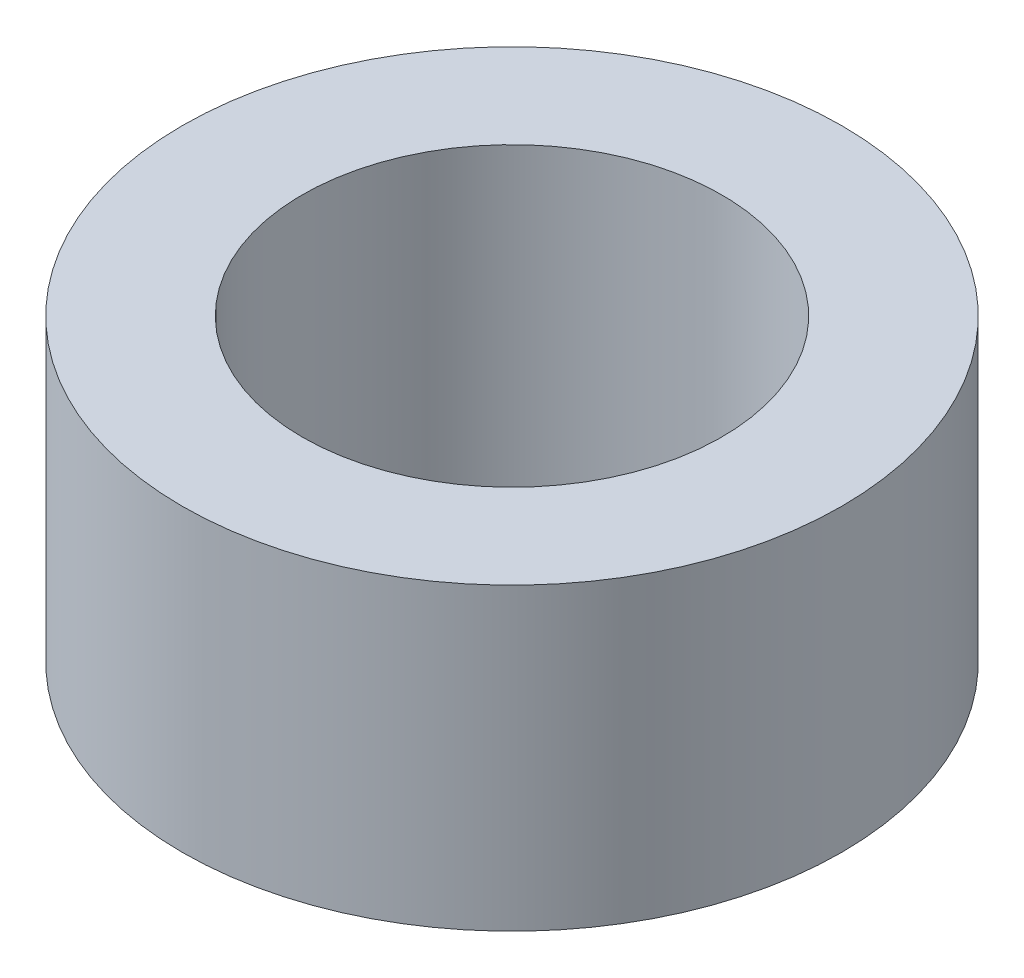
ISO-10303-21;
HEADER;
FILE_DESCRIPTION(('STEP AP214'),'2;1');
FILE_NAME('part.step','',(''),(''),'','','');
FILE_SCHEMA(('AUTOMOTIVE_DESIGN { 1 0 10303 214 1 1 1 1 }'));
ENDSEC;
DATA;
#1=APPLICATION_CONTEXT('core data for automotive mechanical design processes');
#2=APPLICATION_PROTOCOL_DEFINITION('international standard','automotive_design',2000,#1);
#3=PRODUCT_CONTEXT('',#1,'mechanical');
#4=PRODUCT('Part','Part','',(#3));
#5=PRODUCT_RELATED_PRODUCT_CATEGORY('part','',(#4));
#6=PRODUCT_DEFINITION_FORMATION('','',#4);
#7=PRODUCT_DEFINITION_CONTEXT('part definition',#1,'design');
#8=PRODUCT_DEFINITION('design','',#6,#7);
#9=PRODUCT_DEFINITION_SHAPE('','',#8);
#10=(LENGTH_UNIT() NAMED_UNIT(*) SI_UNIT(.MILLI.,.METRE.));
#11=(NAMED_UNIT(*) PLANE_ANGLE_UNIT() SI_UNIT($,.RADIAN.));
#12=(NAMED_UNIT(*) SI_UNIT($,.STERADIAN.) SOLID_ANGLE_UNIT());
#13=UNCERTAINTY_MEASURE_WITH_UNIT(LENGTH_MEASURE(1.E-05),#10,'distance_accuracy_value','');
#14=(GEOMETRIC_REPRESENTATION_CONTEXT(3) GLOBAL_UNCERTAINTY_ASSIGNED_CONTEXT((#13)) GLOBAL_UNIT_ASSIGNED_CONTEXT((#10,
#11,#12)) REPRESENTATION_CONTEXT('',''));
#15=CARTESIAN_POINT('',(0.,0.,0.));
#16=DIRECTION('',(0.,0.,1.));
#17=DIRECTION('',(1.,0.,0.));
#18=AXIS2_PLACEMENT_3D('',#15,#16,#17);
#19=CARTESIAN_POINT('',(0.,10.,0.));
#20=DIRECTION('',(0.,1.,0.));
#21=DIRECTION('',(0.,0.,1.));
#22=AXIS2_PLACEMENT_3D('',#19,#20,#21);
#23=PLANE('',#22);
#24=CARTESIAN_POINT('',(0.,10.,0.));
#25=DIRECTION('',(0.,1.,0.));
#26=DIRECTION('',(0.,0.,1.));
#27=AXIS2_PLACEMENT_3D('',#24,#25,#26);
#28=CIRCLE('',#27,11.);
#29=CARTESIAN_POINT('',(0.,10.,11.));
#30=VERTEX_POINT('',#29);
#31=EDGE_CURVE('E10',#30,#30,#28,.T.);
#32=ORIENTED_EDGE('',*,*,#31,.T.);
#33=EDGE_LOOP('',(#32));
#34=FACE_BOUND('',#33,.T.);
#35=CARTESIAN_POINT('',(0.,10.,0.));
#36=DIRECTION('',(0.,1.,0.));
#37=DIRECTION('',(0.,0.,1.));
#38=AXIS2_PLACEMENT_3D('',#35,#36,#37);
#39=CIRCLE('',#38,7.);
#40=CARTESIAN_POINT('',(0.,10.,7.));
#41=VERTEX_POINT('',#40);
#42=EDGE_CURVE('E29',#41,#41,#39,.T.);
#43=ORIENTED_EDGE('',*,*,#42,.F.);
#44=EDGE_LOOP('',(#43));
#45=FACE_BOUND('',#44,.T.);
#46=ADVANCED_FACE('F14',(#34,#45),#23,.T.);
#47=CARTESIAN_POINT('',(0.,0.,0.));
#48=DIRECTION('',(0.,1.,0.));
#49=DIRECTION('',(0.,0.,1.));
#50=AXIS2_PLACEMENT_3D('',#47,#48,#49);
#51=PLANE('',#50);
#52=CARTESIAN_POINT('',(0.,0.,0.));
#53=DIRECTION('',(0.,1.,0.));
#54=DIRECTION('',(0.,0.,1.));
#55=AXIS2_PLACEMENT_3D('',#52,#53,#54);
#56=CIRCLE('',#55,11.);
#57=CARTESIAN_POINT('',(0.,0.,11.));
#58=VERTEX_POINT('',#57);
#59=EDGE_CURVE('E18',#58,#58,#56,.T.);
#60=ORIENTED_EDGE('',*,*,#59,.F.);
#61=EDGE_LOOP('',(#60));
#62=FACE_BOUND('',#61,.T.);
#63=CARTESIAN_POINT('',(0.,0.,0.));
#64=DIRECTION('',(0.,1.,0.));
#65=DIRECTION('',(0.,0.,1.));
#66=AXIS2_PLACEMENT_3D('',#63,#64,#65);
#67=CIRCLE('',#66,7.);
#68=CARTESIAN_POINT('',(0.,0.,7.));
#69=VERTEX_POINT('',#68);
#70=EDGE_CURVE('E31',#69,#69,#67,.T.);
#71=ORIENTED_EDGE('',*,*,#70,.T.);
#72=EDGE_LOOP('',(#71));
#73=FACE_BOUND('',#72,.T.);
#74=ADVANCED_FACE('F41',(#62,#73),#51,.F.);
#75=CARTESIAN_POINT('',(0.,10.,0.));
#76=DIRECTION('',(0.,-1.,0.));
#77=DIRECTION('',(0.,0.,-1.));
#78=AXIS2_PLACEMENT_3D('',#75,#76,#77);
#79=CYLINDRICAL_SURFACE('',#78,11.);
#80=ORIENTED_EDGE('',*,*,#31,.F.);
#81=EDGE_LOOP('',(#80));
#82=FACE_BOUND('',#81,.T.);
#83=ORIENTED_EDGE('',*,*,#59,.T.);
#84=EDGE_LOOP('',(#83));
#85=FACE_BOUND('',#84,.T.);
#86=ADVANCED_FACE('F16',(#82,#85),#79,.T.);
#87=CARTESIAN_POINT('',(0.,10.,0.));
#88=DIRECTION('',(0.,-1.,0.));
#89=DIRECTION('',(0.,0.,-1.));
#90=AXIS2_PLACEMENT_3D('',#87,#88,#89);
#91=CYLINDRICAL_SURFACE('',#90,7.);
#92=ORIENTED_EDGE('',*,*,#42,.T.);
#93=EDGE_LOOP('',(#92));
#94=FACE_BOUND('',#93,.T.);
#95=ORIENTED_EDGE('',*,*,#70,.F.);
#96=EDGE_LOOP('',(#95));
#97=FACE_BOUND('',#96,.T.);
#98=ADVANCED_FACE('F37',(#94,#97),#91,.F.);
#99=CLOSED_SHELL('',(#46,#74,#86,#98));
#100=MANIFOLD_SOLID_BREP('B1',#99);
#101=ADVANCED_BREP_SHAPE_REPRESENTATION('',(#18,#100),#14);
#102=SHAPE_DEFINITION_REPRESENTATION(#9,#101);
ENDSEC;
END-ISO-10303-21;
